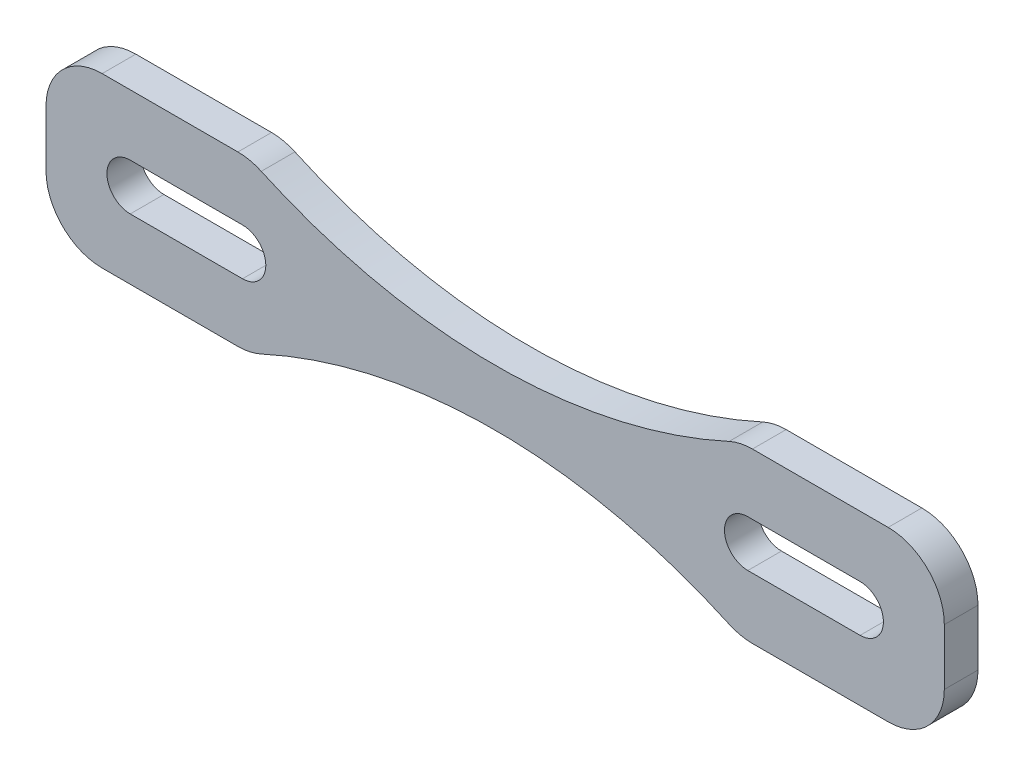
ISO-10303-21;
HEADER;
FILE_DESCRIPTION(('STEP AP214'),'2;1');
FILE_NAME('part.step','',(''),(''),'','','');
FILE_SCHEMA(('AUTOMOTIVE_DESIGN { 1 0 10303 214 1 1 1 1 }'));
ENDSEC;
DATA;
#1=APPLICATION_CONTEXT('core data for automotive mechanical design processes');
#2=APPLICATION_PROTOCOL_DEFINITION('international standard','automotive_design',2000,#1);
#3=PRODUCT_CONTEXT('',#1,'mechanical');
#4=PRODUCT('Part','Part','',(#3));
#5=PRODUCT_RELATED_PRODUCT_CATEGORY('part','',(#4));
#6=PRODUCT_DEFINITION_FORMATION('','',#4);
#7=PRODUCT_DEFINITION_CONTEXT('part definition',#1,'design');
#8=PRODUCT_DEFINITION('design','',#6,#7);
#9=PRODUCT_DEFINITION_SHAPE('','',#8);
#10=(LENGTH_UNIT() NAMED_UNIT(*) SI_UNIT(.MILLI.,.METRE.));
#11=(NAMED_UNIT(*) PLANE_ANGLE_UNIT() SI_UNIT($,.RADIAN.));
#12=(NAMED_UNIT(*) SI_UNIT($,.STERADIAN.) SOLID_ANGLE_UNIT());
#13=UNCERTAINTY_MEASURE_WITH_UNIT(LENGTH_MEASURE(1.E-05),#10,'distance_accuracy_value','');
#14=(GEOMETRIC_REPRESENTATION_CONTEXT(3) GLOBAL_UNCERTAINTY_ASSIGNED_CONTEXT((#13)) GLOBAL_UNIT_ASSIGNED_CONTEXT((#10,
#11,#12)) REPRESENTATION_CONTEXT('',''));
#15=CARTESIAN_POINT('',(0.,0.,0.));
#16=DIRECTION('',(0.,0.,1.));
#17=DIRECTION('',(1.,0.,0.));
#18=AXIS2_PLACEMENT_3D('',#15,#16,#17);
#19=CARTESIAN_POINT('',(0.,-105.,6.));
#20=DIRECTION('',(0.,0.,-1.));
#21=DIRECTION('',(-1.,0.,0.));
#22=AXIS2_PLACEMENT_3D('',#19,#20,#21);
#23=PLANE('',#22);
#24=CARTESIAN_POINT('',(-65.,0.,6.));
#25=DIRECTION('',(0.,0.,1.));
#26=DIRECTION('',(1.,0.,0.));
#27=AXIS2_PLACEMENT_3D('',#24,#25,#26);
#28=CIRCLE('',#27,4.14999999999997);
#29=CARTESIAN_POINT('',(-65.,4.14999999999995,6.));
#30=VERTEX_POINT('',#29);
#31=CARTESIAN_POINT('',(-65.,-4.14999999999998,6.));
#32=VERTEX_POINT('',#31);
#33=EDGE_CURVE('E248',#30,#32,#28,.T.);
#34=ORIENTED_EDGE('',*,*,#33,.F.);
#35=DIRECTION('',(-1.,0.,0.));
#36=VECTOR('',#35,1.);
#37=CARTESIAN_POINT('',(-65.,4.14999999999995,6.));
#38=LINE('',#37,#36);
#39=CARTESIAN_POINT('',(-45.,4.14999999999995,6.));
#40=VERTEX_POINT('',#39);
#41=EDGE_CURVE('E256',#40,#30,#38,.T.);
#42=ORIENTED_EDGE('',*,*,#41,.F.);
#43=CARTESIAN_POINT('',(-45.,0.,6.));
#44=DIRECTION('',(0.,0.,1.));
#45=DIRECTION('',(1.,0.,0.));
#46=AXIS2_PLACEMENT_3D('',#43,#44,#45);
#47=CIRCLE('',#46,4.14999999999997);
#48=CARTESIAN_POINT('',(-45.,-4.14999999999996,6.));
#49=VERTEX_POINT('',#48);
#50=EDGE_CURVE('E253',#49,#40,#47,.T.);
#51=ORIENTED_EDGE('',*,*,#50,.F.);
#52=DIRECTION('',(1.,0.,0.));
#53=VECTOR('',#52,1.);
#54=CARTESIAN_POINT('',(-65.,-4.14999999999998,6.));
#55=LINE('',#54,#53);
#56=EDGE_CURVE('E250',#32,#49,#55,.T.);
#57=ORIENTED_EDGE('',*,*,#56,.F.);
#58=EDGE_LOOP('',(#34,#42,#51,#57));
#59=FACE_BOUND('',#58,.T.);
#60=DIRECTION('',(0.,1.,0.));
#61=VECTOR('',#60,1.);
#62=CARTESIAN_POINT('',(79.9999999999999,-15.,6.));
#63=LINE('',#62,#61);
#64=CARTESIAN_POINT('',(79.9999999999999,-5.,6.));
#65=VERTEX_POINT('',#64);
#66=CARTESIAN_POINT('',(79.9999999999999,5.00000000000001,6.));
#67=VERTEX_POINT('',#66);
#68=EDGE_CURVE('E299',#65,#67,#63,.T.);
#69=ORIENTED_EDGE('',*,*,#68,.T.);
#70=CARTESIAN_POINT('',(69.9999999999999,5.00000000000001,6.));
#71=DIRECTION('',(0.,0.,-1.));
#72=DIRECTION('',(-1.,0.,0.));
#73=AXIS2_PLACEMENT_3D('',#70,#71,#72);
#74=CIRCLE('',#73,10.);
#75=CARTESIAN_POINT('',(69.9999999999999,15.,6.));
#76=VERTEX_POINT('',#75);
#77=EDGE_CURVE('E362',#67,#76,#74,.F.);
#78=ORIENTED_EDGE('',*,*,#77,.T.);
#79=DIRECTION('',(-1.,0.,0.));
#80=VECTOR('',#79,1.);
#81=CARTESIAN_POINT('',(43.5889894354068,15.,6.));
#82=LINE('',#81,#80);
#83=CARTESIAN_POINT('',(45.8257569495584,15.,6.));
#84=VERTEX_POINT('',#83);
#85=EDGE_CURVE('E279',#76,#84,#82,.T.);
#86=ORIENTED_EDGE('',*,*,#85,.T.);
#87=CARTESIAN_POINT('',(45.8257569495584,5.00000000000002,6.));
#88=DIRECTION('',(0.,0.,-1.));
#89=DIRECTION('',(-1.,0.,0.));
#90=AXIS2_PLACEMENT_3D('',#87,#88,#89);
#91=CIRCLE('',#90,10.);
#92=CARTESIAN_POINT('',(41.6597790450531,14.0909090909091,6.));
#93=VERTEX_POINT('',#92);
#94=EDGE_CURVE('E351',#84,#93,#91,.F.);
#95=ORIENTED_EDGE('',*,*,#94,.T.);
#96=CARTESIAN_POINT('',(0.,105.,6.));
#97=DIRECTION('',(0.,0.,-1.));
#98=DIRECTION('',(1.,0.,0.));
#99=AXIS2_PLACEMENT_3D('',#96,#97,#98);
#100=CIRCLE('',#99,100.);
#101=CARTESIAN_POINT('',(-41.6597790450531,14.0909090909091,6.));
#102=VERTEX_POINT('',#101);
#103=EDGE_CURVE('E282',#93,#102,#100,.T.);
#104=ORIENTED_EDGE('',*,*,#103,.T.);
#105=CARTESIAN_POINT('',(-45.8257569495584,5.00000000000003,6.));
#106=DIRECTION('',(0.,0.,-1.));
#107=DIRECTION('',(-1.,0.,0.));
#108=AXIS2_PLACEMENT_3D('',#105,#106,#107);
#109=CIRCLE('',#108,10.);
#110=CARTESIAN_POINT('',(-45.8257569495584,15.,6.));
#111=VERTEX_POINT('',#110);
#112=EDGE_CURVE('E349',#102,#111,#109,.F.);
#113=ORIENTED_EDGE('',*,*,#112,.T.);
#114=DIRECTION('',(-1.,0.,0.));
#115=VECTOR('',#114,1.);
#116=CARTESIAN_POINT('',(-80.0000000000001,15.,6.));
#117=LINE('',#116,#115);
#118=CARTESIAN_POINT('',(-70.0000000000001,15.,6.));
#119=VERTEX_POINT('',#118);
#120=EDGE_CURVE('E286',#111,#119,#117,.T.);
#121=ORIENTED_EDGE('',*,*,#120,.T.);
#122=CARTESIAN_POINT('',(-70.0000000000001,5.00000000000004,6.));
#123=DIRECTION('',(0.,0.,-1.));
#124=DIRECTION('',(-1.,0.,0.));
#125=AXIS2_PLACEMENT_3D('',#122,#123,#124);
#126=CIRCLE('',#125,10.);
#127=CARTESIAN_POINT('',(-80.0000000000001,5.00000000000004,6.));
#128=VERTEX_POINT('',#127);
#129=EDGE_CURVE('E353',#119,#128,#126,.F.);
#130=ORIENTED_EDGE('',*,*,#129,.T.);
#131=DIRECTION('',(0.,-1.,0.));
#132=VECTOR('',#131,1.);
#133=CARTESIAN_POINT('',(-80.0000000000001,-15.,6.));
#134=LINE('',#133,#132);
#135=CARTESIAN_POINT('',(-80.0000000000001,-5.00000000000004,6.));
#136=VERTEX_POINT('',#135);
#137=EDGE_CURVE('E289',#128,#136,#134,.T.);
#138=ORIENTED_EDGE('',*,*,#137,.T.);
#139=CARTESIAN_POINT('',(-70.0000000000001,-5.00000000000004,6.));
#140=DIRECTION('',(0.,0.,-1.));
#141=DIRECTION('',(-1.,0.,0.));
#142=AXIS2_PLACEMENT_3D('',#139,#140,#141);
#143=CIRCLE('',#142,10.);
#144=CARTESIAN_POINT('',(-70.0000000000001,-15.,6.));
#145=VERTEX_POINT('',#144);
#146=EDGE_CURVE('E355',#136,#145,#143,.F.);
#147=ORIENTED_EDGE('',*,*,#146,.T.);
#148=DIRECTION('',(1.,0.,0.));
#149=VECTOR('',#148,1.);
#150=CARTESIAN_POINT('',(-80.0000000000001,-15.,6.));
#151=LINE('',#150,#149);
#152=CARTESIAN_POINT('',(-45.8257569495584,-15.,6.));
#153=VERTEX_POINT('',#152);
#154=EDGE_CURVE('E292',#145,#153,#151,.T.);
#155=ORIENTED_EDGE('',*,*,#154,.T.);
#156=CARTESIAN_POINT('',(-45.8257569495584,-5.00000000000003,6.));
#157=DIRECTION('',(0.,0.,-1.));
#158=DIRECTION('',(-1.,0.,0.));
#159=AXIS2_PLACEMENT_3D('',#156,#157,#158);
#160=CIRCLE('',#159,10.);
#161=CARTESIAN_POINT('',(-41.6597790450531,-14.0909090909091,6.));
#162=VERTEX_POINT('',#161);
#163=EDGE_CURVE('E357',#153,#162,#160,.F.);
#164=ORIENTED_EDGE('',*,*,#163,.T.);
#165=CARTESIAN_POINT('',(0.,-105.,6.));
#166=DIRECTION('',(0.,0.,-1.));
#167=DIRECTION('',(-1.,0.,0.));
#168=AXIS2_PLACEMENT_3D('',#165,#166,#167);
#169=CIRCLE('',#168,100.);
#170=CARTESIAN_POINT('',(41.6597790450531,-14.0909090909091,6.));
#171=VERTEX_POINT('',#170);
#172=EDGE_CURVE('E295',#162,#171,#169,.T.);
#173=ORIENTED_EDGE('',*,*,#172,.T.);
#174=CARTESIAN_POINT('',(45.8257569495584,-5.00000000000001,6.));
#175=DIRECTION('',(0.,0.,-1.));
#176=DIRECTION('',(-1.,0.,0.));
#177=AXIS2_PLACEMENT_3D('',#174,#175,#176);
#178=CIRCLE('',#177,10.);
#179=CARTESIAN_POINT('',(45.8257569495584,-15.,6.));
#180=VERTEX_POINT('',#179);
#181=EDGE_CURVE('E65',#171,#180,#178,.F.);
#182=ORIENTED_EDGE('',*,*,#181,.T.);
#183=DIRECTION('',(1.,0.,0.));
#184=VECTOR('',#183,1.);
#185=CARTESIAN_POINT('',(43.5889894354068,-15.,6.));
#186=LINE('',#185,#184);
#187=CARTESIAN_POINT('',(69.9999999999999,-15.,6.));
#188=VERTEX_POINT('',#187);
#189=EDGE_CURVE('E297',#180,#188,#186,.T.);
#190=ORIENTED_EDGE('',*,*,#189,.T.);
#191=CARTESIAN_POINT('',(69.9999999999999,-5.,6.));
#192=DIRECTION('',(0.,0.,-1.));
#193=DIRECTION('',(-1.,0.,0.));
#194=AXIS2_PLACEMENT_3D('',#191,#192,#193);
#195=CIRCLE('',#194,10.);
#196=EDGE_CURVE('E360',#188,#65,#195,.F.);
#197=ORIENTED_EDGE('',*,*,#196,.T.);
#198=EDGE_LOOP('',(#69,#78,#86,#95,#104,#113,#121,#130,#138,#147,#155,#164,#173,#182,#190,#197));
#199=FACE_BOUND('',#198,.T.);
#200=CARTESIAN_POINT('',(65.,0.,6.));
#201=DIRECTION('',(0.,0.,1.));
#202=DIRECTION('',(-1.,0.,0.));
#203=AXIS2_PLACEMENT_3D('',#200,#201,#202);
#204=CIRCLE('',#203,4.14999999999997);
#205=CARTESIAN_POINT('',(65.,-4.14999999999997,6.));
#206=VERTEX_POINT('',#205);
#207=CARTESIAN_POINT('',(65.,4.14999999999997,6.));
#208=VERTEX_POINT('',#207);
#209=EDGE_CURVE('E207',#206,#208,#204,.T.);
#210=ORIENTED_EDGE('',*,*,#209,.F.);
#211=DIRECTION('',(1.,0.,0.));
#212=VECTOR('',#211,1.);
#213=CARTESIAN_POINT('',(65.,-4.14999999999997,6.));
#214=LINE('',#213,#212);
#215=CARTESIAN_POINT('',(45.,-4.14999999999997,6.));
#216=VERTEX_POINT('',#215);
#217=EDGE_CURVE('E232',#216,#206,#214,.T.);
#218=ORIENTED_EDGE('',*,*,#217,.F.);
#219=CARTESIAN_POINT('',(45.,0.,6.));
#220=DIRECTION('',(0.,0.,1.));
#221=DIRECTION('',(-1.,0.,0.));
#222=AXIS2_PLACEMENT_3D('',#219,#220,#221);
#223=CIRCLE('',#222,4.14999999999997);
#224=CARTESIAN_POINT('',(45.,4.14999999999997,6.));
#225=VERTEX_POINT('',#224);
#226=EDGE_CURVE('E230',#225,#216,#223,.T.);
#227=ORIENTED_EDGE('',*,*,#226,.F.);
#228=DIRECTION('',(-1.,0.,0.));
#229=VECTOR('',#228,1.);
#230=CARTESIAN_POINT('',(65.,4.14999999999997,6.));
#231=LINE('',#230,#229);
#232=EDGE_CURVE('E217',#208,#225,#231,.T.);
#233=ORIENTED_EDGE('',*,*,#232,.F.);
#234=EDGE_LOOP('',(#210,#218,#227,#233));
#235=FACE_BOUND('',#234,.T.);
#236=ADVANCED_FACE('F43',(#59,#199,#235),#23,.F.);
#237=CARTESIAN_POINT('',(0.,-105.,0.));
#238=DIRECTION('',(0.,0.,-1.));
#239=DIRECTION('',(-1.,0.,0.));
#240=AXIS2_PLACEMENT_3D('',#237,#238,#239);
#241=PLANE('',#240);
#242=DIRECTION('',(-1.,0.,0.));
#243=VECTOR('',#242,1.);
#244=CARTESIAN_POINT('',(43.5889894354068,15.,0.));
#245=LINE('',#244,#243);
#246=CARTESIAN_POINT('',(69.9999999999999,15.,0.));
#247=VERTEX_POINT('',#246);
#248=CARTESIAN_POINT('',(45.8257569495584,15.,0.));
#249=VERTEX_POINT('',#248);
#250=EDGE_CURVE('E278',#247,#249,#245,.T.);
#251=ORIENTED_EDGE('',*,*,#250,.F.);
#252=CARTESIAN_POINT('',(69.9999999999999,5.00000000000001,0.));
#253=DIRECTION('',(0.,0.,-1.));
#254=DIRECTION('',(-1.,0.,0.));
#255=AXIS2_PLACEMENT_3D('',#252,#253,#254);
#256=CIRCLE('',#255,10.);
#257=CARTESIAN_POINT('',(79.9999999999999,5.00000000000001,0.));
#258=VERTEX_POINT('',#257);
#259=EDGE_CURVE('E342',#247,#258,#256,.T.);
#260=ORIENTED_EDGE('',*,*,#259,.T.);
#261=DIRECTION('',(0.,1.,0.));
#262=VECTOR('',#261,1.);
#263=CARTESIAN_POINT('',(79.9999999999999,-15.,0.));
#264=LINE('',#263,#262);
#265=CARTESIAN_POINT('',(79.9999999999999,-5.,0.));
#266=VERTEX_POINT('',#265);
#267=EDGE_CURVE('E283',#266,#258,#264,.T.);
#268=ORIENTED_EDGE('',*,*,#267,.F.);
#269=CARTESIAN_POINT('',(69.9999999999999,-5.,0.));
#270=DIRECTION('',(0.,0.,-1.));
#271=DIRECTION('',(-1.,0.,0.));
#272=AXIS2_PLACEMENT_3D('',#269,#270,#271);
#273=CIRCLE('',#272,10.);
#274=CARTESIAN_POINT('',(69.9999999999999,-15.,0.));
#275=VERTEX_POINT('',#274);
#276=EDGE_CURVE('E340',#266,#275,#273,.T.);
#277=ORIENTED_EDGE('',*,*,#276,.T.);
#278=DIRECTION('',(1.,0.,0.));
#279=VECTOR('',#278,1.);
#280=CARTESIAN_POINT('',(43.5889894354068,-15.,0.));
#281=LINE('',#280,#279);
#282=CARTESIAN_POINT('',(45.8257569495584,-15.,0.));
#283=VERTEX_POINT('',#282);
#284=EDGE_CURVE('E320',#283,#275,#281,.T.);
#285=ORIENTED_EDGE('',*,*,#284,.F.);
#286=CARTESIAN_POINT('',(45.8257569495584,-5.00000000000001,0.));
#287=DIRECTION('',(0.,0.,-1.));
#288=DIRECTION('',(-1.,0.,0.));
#289=AXIS2_PLACEMENT_3D('',#286,#287,#288);
#290=CIRCLE('',#289,10.);
#291=CARTESIAN_POINT('',(41.6597790450531,-14.0909090909091,0.));
#292=VERTEX_POINT('',#291);
#293=EDGE_CURVE('E338',#283,#292,#290,.T.);
#294=ORIENTED_EDGE('',*,*,#293,.T.);
#295=CARTESIAN_POINT('',(0.,-105.,0.));
#296=DIRECTION('',(0.,0.,-1.));
#297=DIRECTION('',(-1.,0.,0.));
#298=AXIS2_PLACEMENT_3D('',#295,#296,#297);
#299=CIRCLE('',#298,100.);
#300=CARTESIAN_POINT('',(-41.6597790450531,-14.0909090909091,0.));
#301=VERTEX_POINT('',#300);
#302=EDGE_CURVE('E317',#301,#292,#299,.T.);
#303=ORIENTED_EDGE('',*,*,#302,.F.);
#304=CARTESIAN_POINT('',(-45.8257569495584,-5.00000000000003,0.));
#305=DIRECTION('',(0.,0.,-1.));
#306=DIRECTION('',(-1.,0.,0.));
#307=AXIS2_PLACEMENT_3D('',#304,#305,#306);
#308=CIRCLE('',#307,10.);
#309=CARTESIAN_POINT('',(-45.8257569495584,-15.,0.));
#310=VERTEX_POINT('',#309);
#311=EDGE_CURVE('E336',#301,#310,#308,.T.);
#312=ORIENTED_EDGE('',*,*,#311,.T.);
#313=DIRECTION('',(1.,0.,0.));
#314=VECTOR('',#313,1.);
#315=CARTESIAN_POINT('',(-80.0000000000001,-15.,0.));
#316=LINE('',#315,#314);
#317=CARTESIAN_POINT('',(-70.0000000000001,-15.,0.));
#318=VERTEX_POINT('',#317);
#319=EDGE_CURVE('E314',#318,#310,#316,.T.);
#320=ORIENTED_EDGE('',*,*,#319,.F.);
#321=CARTESIAN_POINT('',(-70.0000000000001,-5.00000000000004,0.));
#322=DIRECTION('',(0.,0.,-1.));
#323=DIRECTION('',(-1.,0.,0.));
#324=AXIS2_PLACEMENT_3D('',#321,#322,#323);
#325=CIRCLE('',#324,10.);
#326=CARTESIAN_POINT('',(-80.0000000000001,-5.00000000000004,0.));
#327=VERTEX_POINT('',#326);
#328=EDGE_CURVE('E334',#318,#327,#325,.T.);
#329=ORIENTED_EDGE('',*,*,#328,.T.);
#330=DIRECTION('',(0.,-1.,0.));
#331=VECTOR('',#330,1.);
#332=CARTESIAN_POINT('',(-80.0000000000001,-15.,0.));
#333=LINE('',#332,#331);
#334=CARTESIAN_POINT('',(-80.0000000000001,5.00000000000004,0.));
#335=VERTEX_POINT('',#334);
#336=EDGE_CURVE('E311',#335,#327,#333,.T.);
#337=ORIENTED_EDGE('',*,*,#336,.F.);
#338=CARTESIAN_POINT('',(-70.0000000000001,5.00000000000004,0.));
#339=DIRECTION('',(0.,0.,-1.));
#340=DIRECTION('',(-1.,0.,0.));
#341=AXIS2_PLACEMENT_3D('',#338,#339,#340);
#342=CIRCLE('',#341,10.);
#343=CARTESIAN_POINT('',(-70.0000000000001,15.,0.));
#344=VERTEX_POINT('',#343);
#345=EDGE_CURVE('E332',#335,#344,#342,.T.);
#346=ORIENTED_EDGE('',*,*,#345,.T.);
#347=DIRECTION('',(-1.,0.,0.));
#348=VECTOR('',#347,1.);
#349=CARTESIAN_POINT('',(-80.0000000000001,15.,0.));
#350=LINE('',#349,#348);
#351=CARTESIAN_POINT('',(-45.8257569495584,15.,0.));
#352=VERTEX_POINT('',#351);
#353=EDGE_CURVE('E308',#352,#344,#350,.T.);
#354=ORIENTED_EDGE('',*,*,#353,.F.);
#355=CARTESIAN_POINT('',(-45.8257569495584,5.00000000000003,0.));
#356=DIRECTION('',(0.,0.,-1.));
#357=DIRECTION('',(-1.,0.,0.));
#358=AXIS2_PLACEMENT_3D('',#355,#356,#357);
#359=CIRCLE('',#358,10.);
#360=CARTESIAN_POINT('',(-41.6597790450531,14.0909090909091,0.));
#361=VERTEX_POINT('',#360);
#362=EDGE_CURVE('E328',#352,#361,#359,.T.);
#363=ORIENTED_EDGE('',*,*,#362,.T.);
#364=CARTESIAN_POINT('',(0.,105.,0.));
#365=DIRECTION('',(0.,0.,-1.));
#366=DIRECTION('',(1.,0.,0.));
#367=AXIS2_PLACEMENT_3D('',#364,#365,#366);
#368=CIRCLE('',#367,100.);
#369=CARTESIAN_POINT('',(41.6597790450531,14.0909090909091,0.));
#370=VERTEX_POINT('',#369);
#371=EDGE_CURVE('E305',#370,#361,#368,.T.);
#372=ORIENTED_EDGE('',*,*,#371,.F.);
#373=CARTESIAN_POINT('',(45.8257569495584,5.00000000000002,0.));
#374=DIRECTION('',(0.,0.,-1.));
#375=DIRECTION('',(-1.,0.,0.));
#376=AXIS2_PLACEMENT_3D('',#373,#374,#375);
#377=CIRCLE('',#376,10.);
#378=EDGE_CURVE('E330',#370,#249,#377,.T.);
#379=ORIENTED_EDGE('',*,*,#378,.T.);
#380=EDGE_LOOP('',(#251,#260,#268,#277,#285,#294,#303,#312,#320,#329,#337,#346,#354,#363,#372,#379));
#381=FACE_BOUND('',#380,.T.);
#382=DIRECTION('',(-1.,0.,0.));
#383=VECTOR('',#382,1.);
#384=CARTESIAN_POINT('',(-65.,4.14999999999995,0.));
#385=LINE('',#384,#383);
#386=CARTESIAN_POINT('',(-45.,4.14999999999995,0.));
#387=VERTEX_POINT('',#386);
#388=CARTESIAN_POINT('',(-65.,4.14999999999995,0.));
#389=VERTEX_POINT('',#388);
#390=EDGE_CURVE('E251',#387,#389,#385,.T.);
#391=ORIENTED_EDGE('',*,*,#390,.T.);
#392=CARTESIAN_POINT('',(-65.,0.,0.));
#393=DIRECTION('',(0.,0.,1.));
#394=DIRECTION('',(1.,0.,0.));
#395=AXIS2_PLACEMENT_3D('',#392,#393,#394);
#396=CIRCLE('',#395,4.14999999999997);
#397=CARTESIAN_POINT('',(-65.,-4.14999999999998,0.));
#398=VERTEX_POINT('',#397);
#399=EDGE_CURVE('E225',#389,#398,#396,.T.);
#400=ORIENTED_EDGE('',*,*,#399,.T.);
#401=DIRECTION('',(1.,0.,0.));
#402=VECTOR('',#401,1.);
#403=CARTESIAN_POINT('',(-65.,-4.14999999999998,0.));
#404=LINE('',#403,#402);
#405=CARTESIAN_POINT('',(-45.,-4.14999999999996,0.));
#406=VERTEX_POINT('',#405);
#407=EDGE_CURVE('E261',#398,#406,#404,.T.);
#408=ORIENTED_EDGE('',*,*,#407,.T.);
#409=CARTESIAN_POINT('',(-45.,0.,0.));
#410=DIRECTION('',(0.,0.,1.));
#411=DIRECTION('',(1.,0.,0.));
#412=AXIS2_PLACEMENT_3D('',#409,#410,#411);
#413=CIRCLE('',#412,4.14999999999997);
#414=EDGE_CURVE('E264',#406,#387,#413,.T.);
#415=ORIENTED_EDGE('',*,*,#414,.T.);
#416=EDGE_LOOP('',(#391,#400,#408,#415));
#417=FACE_BOUND('',#416,.T.);
#418=DIRECTION('',(1.,0.,0.));
#419=VECTOR('',#418,1.);
#420=CARTESIAN_POINT('',(65.,-4.14999999999997,0.));
#421=LINE('',#420,#419);
#422=CARTESIAN_POINT('',(45.,-4.14999999999996,0.));
#423=VERTEX_POINT('',#422);
#424=CARTESIAN_POINT('',(65.,-4.14999999999997,0.));
#425=VERTEX_POINT('',#424);
#426=EDGE_CURVE('E218',#423,#425,#421,.T.);
#427=ORIENTED_EDGE('',*,*,#426,.T.);
#428=CARTESIAN_POINT('',(65.,0.,0.));
#429=DIRECTION('',(0.,0.,1.));
#430=DIRECTION('',(-1.,0.,0.));
#431=AXIS2_PLACEMENT_3D('',#428,#429,#430);
#432=CIRCLE('',#431,4.14999999999997);
#433=CARTESIAN_POINT('',(65.,4.14999999999997,0.));
#434=VERTEX_POINT('',#433);
#435=EDGE_CURVE('E236',#425,#434,#432,.T.);
#436=ORIENTED_EDGE('',*,*,#435,.T.);
#437=DIRECTION('',(-1.,0.,0.));
#438=VECTOR('',#437,1.);
#439=CARTESIAN_POINT('',(65.,4.14999999999997,0.));
#440=LINE('',#439,#438);
#441=CARTESIAN_POINT('',(45.,4.14999999999997,0.));
#442=VERTEX_POINT('',#441);
#443=EDGE_CURVE('E224',#434,#442,#440,.T.);
#444=ORIENTED_EDGE('',*,*,#443,.T.);
#445=CARTESIAN_POINT('',(45.,0.,0.));
#446=DIRECTION('',(0.,0.,1.));
#447=DIRECTION('',(-1.,0.,0.));
#448=AXIS2_PLACEMENT_3D('',#445,#446,#447);
#449=CIRCLE('',#448,4.14999999999997);
#450=EDGE_CURVE('E239',#442,#423,#449,.T.);
#451=ORIENTED_EDGE('',*,*,#450,.T.);
#452=EDGE_LOOP('',(#427,#436,#444,#451));
#453=FACE_BOUND('',#452,.T.);
#454=ADVANCED_FACE('F404',(#381,#417,#453),#241,.T.);
#455=CARTESIAN_POINT('',(43.5889894354068,15.,6.));
#456=DIRECTION('',(0.,-1.,0.));
#457=DIRECTION('',(1.,0.,0.));
#458=AXIS2_PLACEMENT_3D('',#455,#456,#457);
#459=PLANE('',#458);
#460=ORIENTED_EDGE('',*,*,#85,.F.);
#461=DIRECTION('',(0.,0.,-1.));
#462=VECTOR('',#461,1.);
#463=CARTESIAN_POINT('',(69.9999999999999,15.,6.));
#464=LINE('',#463,#462);
#465=EDGE_CURVE('E325',#76,#247,#464,.T.);
#466=ORIENTED_EDGE('',*,*,#465,.T.);
#467=ORIENTED_EDGE('',*,*,#250,.T.);
#468=DIRECTION('',(0.,0.,-1.));
#469=VECTOR('',#468,1.);
#470=CARTESIAN_POINT('',(45.8257569495584,15.,6.));
#471=LINE('',#470,#469);
#472=EDGE_CURVE('E302',#249,#84,#471,.F.);
#473=ORIENTED_EDGE('',*,*,#472,.T.);
#474=EDGE_LOOP('',(#460,#466,#467,#473));
#475=FACE_BOUND('',#474,.T.);
#476=ADVANCED_FACE('F453',(#475),#459,.F.);
#477=CARTESIAN_POINT('',(0.,105.,6.));
#478=DIRECTION('',(0.,0.,-1.));
#479=DIRECTION('',(-1.,0.,0.));
#480=AXIS2_PLACEMENT_3D('',#477,#478,#479);
#481=CYLINDRICAL_SURFACE('',#480,100.);
#482=ORIENTED_EDGE('',*,*,#103,.F.);
#483=DIRECTION('',(0.,0.,-1.));
#484=VECTOR('',#483,1.);
#485=CARTESIAN_POINT('',(41.6597790450531,14.0909090909091,6.));
#486=LINE('',#485,#484);
#487=EDGE_CURVE('E11',#93,#370,#486,.T.);
#488=ORIENTED_EDGE('',*,*,#487,.T.);
#489=ORIENTED_EDGE('',*,*,#371,.T.);
#490=DIRECTION('',(0.,0.,-1.));
#491=VECTOR('',#490,1.);
#492=CARTESIAN_POINT('',(-41.6597790450531,14.0909090909091,6.));
#493=LINE('',#492,#491);
#494=EDGE_CURVE('E51',#361,#102,#493,.F.);
#495=ORIENTED_EDGE('',*,*,#494,.T.);
#496=EDGE_LOOP('',(#482,#488,#489,#495));
#497=FACE_BOUND('',#496,.T.);
#498=ADVANCED_FACE('F390',(#497),#481,.F.);
#499=CARTESIAN_POINT('',(-80.0000000000001,15.,6.));
#500=DIRECTION('',(0.,-1.,0.));
#501=DIRECTION('',(1.,0.,0.));
#502=AXIS2_PLACEMENT_3D('',#499,#500,#501);
#503=PLANE('',#502);
#504=ORIENTED_EDGE('',*,*,#353,.T.);
#505=DIRECTION('',(0.,0.,-1.));
#506=VECTOR('',#505,1.);
#507=CARTESIAN_POINT('',(-70.0000000000001,15.,6.));
#508=LINE('',#507,#506);
#509=EDGE_CURVE('E386',#344,#119,#508,.F.);
#510=ORIENTED_EDGE('',*,*,#509,.T.);
#511=ORIENTED_EDGE('',*,*,#120,.F.);
#512=DIRECTION('',(0.,0.,-1.));
#513=VECTOR('',#512,1.);
#514=CARTESIAN_POINT('',(-45.8257569495584,15.,6.));
#515=LINE('',#514,#513);
#516=EDGE_CURVE('E383',#111,#352,#515,.T.);
#517=ORIENTED_EDGE('',*,*,#516,.T.);
#518=EDGE_LOOP('',(#504,#510,#511,#517));
#519=FACE_BOUND('',#518,.T.);
#520=ADVANCED_FACE('F400',(#519),#503,.F.);
#521=CARTESIAN_POINT('',(-80.0000000000001,-15.,6.));
#522=DIRECTION('',(1.,0.,0.));
#523=DIRECTION('',(0.,0.,-1.));
#524=AXIS2_PLACEMENT_3D('',#521,#522,#523);
#525=PLANE('',#524);
#526=ORIENTED_EDGE('',*,*,#336,.T.);
#527=DIRECTION('',(0.,0.,-1.));
#528=VECTOR('',#527,1.);
#529=CARTESIAN_POINT('',(-80.0000000000001,-5.00000000000004,6.));
#530=LINE('',#529,#528);
#531=EDGE_CURVE('E381',#327,#136,#530,.F.);
#532=ORIENTED_EDGE('',*,*,#531,.T.);
#533=ORIENTED_EDGE('',*,*,#137,.F.);
#534=DIRECTION('',(0.,0.,-1.));
#535=VECTOR('',#534,1.);
#536=CARTESIAN_POINT('',(-80.0000000000001,5.00000000000004,6.));
#537=LINE('',#536,#535);
#538=EDGE_CURVE('E378',#128,#335,#537,.T.);
#539=ORIENTED_EDGE('',*,*,#538,.T.);
#540=EDGE_LOOP('',(#526,#532,#533,#539));
#541=FACE_BOUND('',#540,.T.);
#542=ADVANCED_FACE('F413',(#541),#525,.F.);
#543=CARTESIAN_POINT('',(-80.0000000000001,-15.,6.));
#544=DIRECTION('',(0.,1.,0.));
#545=DIRECTION('',(-1.,0.,0.));
#546=AXIS2_PLACEMENT_3D('',#543,#544,#545);
#547=PLANE('',#546);
#548=ORIENTED_EDGE('',*,*,#319,.T.);
#549=DIRECTION('',(0.,0.,-1.));
#550=VECTOR('',#549,1.);
#551=CARTESIAN_POINT('',(-45.8257569495584,-15.,6.));
#552=LINE('',#551,#550);
#553=EDGE_CURVE('E376',#310,#153,#552,.F.);
#554=ORIENTED_EDGE('',*,*,#553,.T.);
#555=ORIENTED_EDGE('',*,*,#154,.F.);
#556=DIRECTION('',(0.,0.,-1.));
#557=VECTOR('',#556,1.);
#558=CARTESIAN_POINT('',(-70.0000000000001,-15.,6.));
#559=LINE('',#558,#557);
#560=EDGE_CURVE('E373',#145,#318,#559,.T.);
#561=ORIENTED_EDGE('',*,*,#560,.T.);
#562=EDGE_LOOP('',(#548,#554,#555,#561));
#563=FACE_BOUND('',#562,.T.);
#564=ADVANCED_FACE('F422',(#563),#547,.F.);
#565=CARTESIAN_POINT('',(0.,-105.,6.));
#566=DIRECTION('',(0.,0.,-1.));
#567=DIRECTION('',(-1.,0.,0.));
#568=AXIS2_PLACEMENT_3D('',#565,#566,#567);
#569=CYLINDRICAL_SURFACE('',#568,100.);
#570=ORIENTED_EDGE('',*,*,#302,.T.);
#571=DIRECTION('',(0.,0.,-1.));
#572=VECTOR('',#571,1.);
#573=CARTESIAN_POINT('',(41.6597790450531,-14.0909090909091,6.));
#574=LINE('',#573,#572);
#575=EDGE_CURVE('E371',#292,#171,#574,.F.);
#576=ORIENTED_EDGE('',*,*,#575,.T.);
#577=ORIENTED_EDGE('',*,*,#172,.F.);
#578=DIRECTION('',(0.,0.,-1.));
#579=VECTOR('',#578,1.);
#580=CARTESIAN_POINT('',(-41.6597790450531,-14.0909090909091,6.));
#581=LINE('',#580,#579);
#582=EDGE_CURVE('E368',#162,#301,#581,.T.);
#583=ORIENTED_EDGE('',*,*,#582,.T.);
#584=EDGE_LOOP('',(#570,#576,#577,#583));
#585=FACE_BOUND('',#584,.T.);
#586=ADVANCED_FACE('F431',(#585),#569,.F.);
#587=CARTESIAN_POINT('',(43.5889894354068,-15.,6.));
#588=DIRECTION('',(0.,1.,0.));
#589=DIRECTION('',(-1.,0.,0.));
#590=AXIS2_PLACEMENT_3D('',#587,#588,#589);
#591=PLANE('',#590);
#592=ORIENTED_EDGE('',*,*,#284,.T.);
#593=DIRECTION('',(0.,0.,-1.));
#594=VECTOR('',#593,1.);
#595=CARTESIAN_POINT('',(69.9999999999999,-15.,6.));
#596=LINE('',#595,#594);
#597=EDGE_CURVE('E58',#275,#188,#596,.F.);
#598=ORIENTED_EDGE('',*,*,#597,.T.);
#599=ORIENTED_EDGE('',*,*,#189,.F.);
#600=DIRECTION('',(0.,0.,-1.));
#601=VECTOR('',#600,1.);
#602=CARTESIAN_POINT('',(45.8257569495584,-15.,6.));
#603=LINE('',#602,#601);
#604=EDGE_CURVE('E364',#180,#283,#603,.T.);
#605=ORIENTED_EDGE('',*,*,#604,.T.);
#606=EDGE_LOOP('',(#592,#598,#599,#605));
#607=FACE_BOUND('',#606,.T.);
#608=ADVANCED_FACE('F437',(#607),#591,.F.);
#609=CARTESIAN_POINT('',(79.9999999999999,-15.,6.));
#610=DIRECTION('',(-1.,0.,0.));
#611=DIRECTION('',(0.,0.,1.));
#612=AXIS2_PLACEMENT_3D('',#609,#610,#611);
#613=PLANE('',#612);
#614=ORIENTED_EDGE('',*,*,#267,.T.);
#615=DIRECTION('',(0.,0.,-1.));
#616=VECTOR('',#615,1.);
#617=CARTESIAN_POINT('',(79.9999999999999,5.00000000000001,6.));
#618=LINE('',#617,#616);
#619=EDGE_CURVE('E347',#258,#67,#618,.F.);
#620=ORIENTED_EDGE('',*,*,#619,.T.);
#621=ORIENTED_EDGE('',*,*,#68,.F.);
#622=DIRECTION('',(0.,0.,-1.));
#623=VECTOR('',#622,1.);
#624=CARTESIAN_POINT('',(79.9999999999999,-5.,6.));
#625=LINE('',#624,#623);
#626=EDGE_CURVE('E344',#65,#266,#625,.T.);
#627=ORIENTED_EDGE('',*,*,#626,.T.);
#628=EDGE_LOOP('',(#614,#620,#621,#627));
#629=FACE_BOUND('',#628,.T.);
#630=ADVANCED_FACE('F445',(#629),#613,.F.);
#631=CARTESIAN_POINT('',(-65.,0.,6.));
#632=DIRECTION('',(0.,0.,-1.));
#633=DIRECTION('',(-1.,0.,0.));
#634=AXIS2_PLACEMENT_3D('',#631,#632,#633);
#635=CYLINDRICAL_SURFACE('',#634,4.14999999999997);
#636=ORIENTED_EDGE('',*,*,#399,.F.);
#637=DIRECTION('',(0.,0.,-1.));
#638=VECTOR('',#637,1.);
#639=CARTESIAN_POINT('',(-65.,4.14999999999995,6.));
#640=LINE('',#639,#638);
#641=EDGE_CURVE('E258',#30,#389,#640,.T.);
#642=ORIENTED_EDGE('',*,*,#641,.F.);
#643=ORIENTED_EDGE('',*,*,#33,.T.);
#644=DIRECTION('',(0.,0.,-1.));
#645=VECTOR('',#644,1.);
#646=CARTESIAN_POINT('',(-65.,-4.14999999999998,6.));
#647=LINE('',#646,#645);
#648=EDGE_CURVE('E275',#32,#398,#647,.T.);
#649=ORIENTED_EDGE('',*,*,#648,.T.);
#650=EDGE_LOOP('',(#636,#642,#643,#649));
#651=FACE_BOUND('',#650,.T.);
#652=ADVANCED_FACE('F472',(#651),#635,.F.);
#653=CARTESIAN_POINT('',(-65.,-4.14999999999998,6.));
#654=DIRECTION('',(0.,1.,0.));
#655=DIRECTION('',(-1.,0.,0.));
#656=AXIS2_PLACEMENT_3D('',#653,#654,#655);
#657=PLANE('',#656);
#658=ORIENTED_EDGE('',*,*,#407,.F.);
#659=ORIENTED_EDGE('',*,*,#648,.F.);
#660=ORIENTED_EDGE('',*,*,#56,.T.);
#661=DIRECTION('',(0.,0.,-1.));
#662=VECTOR('',#661,1.);
#663=CARTESIAN_POINT('',(-45.,-4.14999999999996,6.));
#664=LINE('',#663,#662);
#665=EDGE_CURVE('E273',#49,#406,#664,.T.);
#666=ORIENTED_EDGE('',*,*,#665,.T.);
#667=EDGE_LOOP('',(#658,#659,#660,#666));
#668=FACE_BOUND('',#667,.T.);
#669=ADVANCED_FACE('F616',(#668),#657,.T.);
#670=CARTESIAN_POINT('',(-45.,0.,6.));
#671=DIRECTION('',(0.,0.,-1.));
#672=DIRECTION('',(-1.,0.,0.));
#673=AXIS2_PLACEMENT_3D('',#670,#671,#672);
#674=CYLINDRICAL_SURFACE('',#673,4.14999999999997);
#675=ORIENTED_EDGE('',*,*,#414,.F.);
#676=ORIENTED_EDGE('',*,*,#665,.F.);
#677=ORIENTED_EDGE('',*,*,#50,.T.);
#678=DIRECTION('',(0.,0.,-1.));
#679=VECTOR('',#678,1.);
#680=CARTESIAN_POINT('',(-45.,4.14999999999995,6.));
#681=LINE('',#680,#679);
#682=EDGE_CURVE('E271',#40,#387,#681,.T.);
#683=ORIENTED_EDGE('',*,*,#682,.T.);
#684=EDGE_LOOP('',(#675,#676,#677,#683));
#685=FACE_BOUND('',#684,.T.);
#686=ADVANCED_FACE('F608',(#685),#674,.F.);
#687=CARTESIAN_POINT('',(-65.,4.14999999999995,6.));
#688=DIRECTION('',(0.,-1.,0.));
#689=DIRECTION('',(1.,0.,0.));
#690=AXIS2_PLACEMENT_3D('',#687,#688,#689);
#691=PLANE('',#690);
#692=ORIENTED_EDGE('',*,*,#390,.F.);
#693=ORIENTED_EDGE('',*,*,#682,.F.);
#694=ORIENTED_EDGE('',*,*,#41,.T.);
#695=ORIENTED_EDGE('',*,*,#641,.T.);
#696=EDGE_LOOP('',(#692,#693,#694,#695));
#697=FACE_BOUND('',#696,.T.);
#698=ADVANCED_FACE('F601',(#697),#691,.T.);
#699=CARTESIAN_POINT('',(65.,0.,6.));
#700=DIRECTION('',(0.,0.,-1.));
#701=DIRECTION('',(-1.,0.,0.));
#702=AXIS2_PLACEMENT_3D('',#699,#700,#701);
#703=CYLINDRICAL_SURFACE('',#702,4.14999999999997);
#704=ORIENTED_EDGE('',*,*,#435,.F.);
#705=DIRECTION('',(0.,0.,-1.));
#706=VECTOR('',#705,1.);
#707=CARTESIAN_POINT('',(65.,-4.14999999999997,6.));
#708=LINE('',#707,#706);
#709=EDGE_CURVE('E213',#206,#425,#708,.T.);
#710=ORIENTED_EDGE('',*,*,#709,.F.);
#711=ORIENTED_EDGE('',*,*,#209,.T.);
#712=DIRECTION('',(0.,0.,-1.));
#713=VECTOR('',#712,1.);
#714=CARTESIAN_POINT('',(65.,4.14999999999997,6.));
#715=LINE('',#714,#713);
#716=EDGE_CURVE('E210',#208,#434,#715,.T.);
#717=ORIENTED_EDGE('',*,*,#716,.T.);
#718=EDGE_LOOP('',(#704,#710,#711,#717));
#719=FACE_BOUND('',#718,.T.);
#720=ADVANCED_FACE('F209',(#719),#703,.F.);
#721=CARTESIAN_POINT('',(65.,4.14999999999997,6.));
#722=DIRECTION('',(0.,-1.,0.));
#723=DIRECTION('',(0.,0.,-1.));
#724=AXIS2_PLACEMENT_3D('',#721,#722,#723);
#725=PLANE('',#724);
#726=ORIENTED_EDGE('',*,*,#443,.F.);
#727=ORIENTED_EDGE('',*,*,#716,.F.);
#728=ORIENTED_EDGE('',*,*,#232,.T.);
#729=DIRECTION('',(0.,0.,-1.));
#730=VECTOR('',#729,1.);
#731=CARTESIAN_POINT('',(45.,4.14999999999997,6.));
#732=LINE('',#731,#730);
#733=EDGE_CURVE('E226',#225,#442,#732,.T.);
#734=ORIENTED_EDGE('',*,*,#733,.T.);
#735=EDGE_LOOP('',(#726,#727,#728,#734));
#736=FACE_BOUND('',#735,.T.);
#737=ADVANCED_FACE('F221',(#736),#725,.T.);
#738=CARTESIAN_POINT('',(45.,0.,6.));
#739=DIRECTION('',(0.,0.,-1.));
#740=DIRECTION('',(-1.,0.,0.));
#741=AXIS2_PLACEMENT_3D('',#738,#739,#740);
#742=CYLINDRICAL_SURFACE('',#741,4.14999999999997);
#743=ORIENTED_EDGE('',*,*,#450,.F.);
#744=ORIENTED_EDGE('',*,*,#733,.F.);
#745=ORIENTED_EDGE('',*,*,#226,.T.);
#746=DIRECTION('',(0.,0.,-1.));
#747=VECTOR('',#746,1.);
#748=CARTESIAN_POINT('',(45.,-4.14999999999996,6.));
#749=LINE('',#748,#747);
#750=EDGE_CURVE('E245',#216,#423,#749,.T.);
#751=ORIENTED_EDGE('',*,*,#750,.T.);
#752=EDGE_LOOP('',(#743,#744,#745,#751));
#753=FACE_BOUND('',#752,.T.);
#754=ADVANCED_FACE('F580',(#753),#742,.F.);
#755=CARTESIAN_POINT('',(65.,-4.14999999999997,6.));
#756=DIRECTION('',(0.,1.,0.));
#757=DIRECTION('',(0.,0.,1.));
#758=AXIS2_PLACEMENT_3D('',#755,#756,#757);
#759=PLANE('',#758);
#760=ORIENTED_EDGE('',*,*,#426,.F.);
#761=ORIENTED_EDGE('',*,*,#750,.F.);
#762=ORIENTED_EDGE('',*,*,#217,.T.);
#763=ORIENTED_EDGE('',*,*,#709,.T.);
#764=EDGE_LOOP('',(#760,#761,#762,#763));
#765=FACE_BOUND('',#764,.T.);
#766=ADVANCED_FACE('F493',(#765),#759,.T.);
#767=CARTESIAN_POINT('',(69.9999999999999,5.00000000000001,6.));
#768=DIRECTION('',(0.,0.,-1.));
#769=DIRECTION('',(-1.,0.,0.));
#770=AXIS2_PLACEMENT_3D('',#767,#768,#769);
#771=CYLINDRICAL_SURFACE('',#770,10.);
#772=ORIENTED_EDGE('',*,*,#77,.F.);
#773=ORIENTED_EDGE('',*,*,#619,.F.);
#774=ORIENTED_EDGE('',*,*,#259,.F.);
#775=ORIENTED_EDGE('',*,*,#465,.F.);
#776=EDGE_LOOP('',(#772,#773,#774,#775));
#777=FACE_BOUND('',#776,.T.);
#778=ADVANCED_FACE('F451',(#777),#771,.T.);
#779=CARTESIAN_POINT('',(69.9999999999999,-5.,6.));
#780=DIRECTION('',(0.,0.,-1.));
#781=DIRECTION('',(-1.,0.,0.));
#782=AXIS2_PLACEMENT_3D('',#779,#780,#781);
#783=CYLINDRICAL_SURFACE('',#782,10.);
#784=ORIENTED_EDGE('',*,*,#196,.F.);
#785=ORIENTED_EDGE('',*,*,#597,.F.);
#786=ORIENTED_EDGE('',*,*,#276,.F.);
#787=ORIENTED_EDGE('',*,*,#626,.F.);
#788=EDGE_LOOP('',(#784,#785,#786,#787));
#789=FACE_BOUND('',#788,.T.);
#790=ADVANCED_FACE('F442',(#789),#783,.T.);
#791=CARTESIAN_POINT('',(45.8257569495584,-5.00000000000001,6.));
#792=DIRECTION('',(0.,0.,-1.));
#793=DIRECTION('',(-1.,0.,0.));
#794=AXIS2_PLACEMENT_3D('',#791,#792,#793);
#795=CYLINDRICAL_SURFACE('',#794,10.);
#796=ORIENTED_EDGE('',*,*,#181,.F.);
#797=ORIENTED_EDGE('',*,*,#575,.F.);
#798=ORIENTED_EDGE('',*,*,#293,.F.);
#799=ORIENTED_EDGE('',*,*,#604,.F.);
#800=EDGE_LOOP('',(#796,#797,#798,#799));
#801=FACE_BOUND('',#800,.T.);
#802=ADVANCED_FACE('F435',(#801),#795,.T.);
#803=CARTESIAN_POINT('',(-45.8257569495584,-5.00000000000003,6.));
#804=DIRECTION('',(0.,0.,-1.));
#805=DIRECTION('',(-1.,0.,0.));
#806=AXIS2_PLACEMENT_3D('',#803,#804,#805);
#807=CYLINDRICAL_SURFACE('',#806,10.);
#808=ORIENTED_EDGE('',*,*,#163,.F.);
#809=ORIENTED_EDGE('',*,*,#553,.F.);
#810=ORIENTED_EDGE('',*,*,#311,.F.);
#811=ORIENTED_EDGE('',*,*,#582,.F.);
#812=EDGE_LOOP('',(#808,#809,#810,#811));
#813=FACE_BOUND('',#812,.T.);
#814=ADVANCED_FACE('F428',(#813),#807,.T.);
#815=CARTESIAN_POINT('',(-70.0000000000001,-5.00000000000004,6.));
#816=DIRECTION('',(0.,0.,-1.));
#817=DIRECTION('',(-1.,0.,0.));
#818=AXIS2_PLACEMENT_3D('',#815,#816,#817);
#819=CYLINDRICAL_SURFACE('',#818,10.);
#820=ORIENTED_EDGE('',*,*,#146,.F.);
#821=ORIENTED_EDGE('',*,*,#531,.F.);
#822=ORIENTED_EDGE('',*,*,#328,.F.);
#823=ORIENTED_EDGE('',*,*,#560,.F.);
#824=EDGE_LOOP('',(#820,#821,#822,#823));
#825=FACE_BOUND('',#824,.T.);
#826=ADVANCED_FACE('F419',(#825),#819,.T.);
#827=CARTESIAN_POINT('',(-70.0000000000001,5.00000000000004,6.));
#828=DIRECTION('',(0.,0.,-1.));
#829=DIRECTION('',(-1.,0.,0.));
#830=AXIS2_PLACEMENT_3D('',#827,#828,#829);
#831=CYLINDRICAL_SURFACE('',#830,10.);
#832=ORIENTED_EDGE('',*,*,#129,.F.);
#833=ORIENTED_EDGE('',*,*,#509,.F.);
#834=ORIENTED_EDGE('',*,*,#345,.F.);
#835=ORIENTED_EDGE('',*,*,#538,.F.);
#836=EDGE_LOOP('',(#832,#833,#834,#835));
#837=FACE_BOUND('',#836,.T.);
#838=ADVANCED_FACE('F410',(#837),#831,.T.);
#839=CARTESIAN_POINT('',(45.8257569495584,5.00000000000002,6.));
#840=DIRECTION('',(0.,0.,-1.));
#841=DIRECTION('',(-1.,0.,0.));
#842=AXIS2_PLACEMENT_3D('',#839,#840,#841);
#843=CYLINDRICAL_SURFACE('',#842,10.);
#844=ORIENTED_EDGE('',*,*,#94,.F.);
#845=ORIENTED_EDGE('',*,*,#472,.F.);
#846=ORIENTED_EDGE('',*,*,#378,.F.);
#847=ORIENTED_EDGE('',*,*,#487,.F.);
#848=EDGE_LOOP('',(#844,#845,#846,#847));
#849=FACE_BOUND('',#848,.T.);
#850=ADVANCED_FACE('F456',(#849),#843,.T.);
#851=CARTESIAN_POINT('',(-45.8257569495584,5.00000000000003,6.));
#852=DIRECTION('',(0.,0.,-1.));
#853=DIRECTION('',(-1.,0.,0.));
#854=AXIS2_PLACEMENT_3D('',#851,#852,#853);
#855=CYLINDRICAL_SURFACE('',#854,10.);
#856=ORIENTED_EDGE('',*,*,#112,.F.);
#857=ORIENTED_EDGE('',*,*,#494,.F.);
#858=ORIENTED_EDGE('',*,*,#362,.F.);
#859=ORIENTED_EDGE('',*,*,#516,.F.);
#860=EDGE_LOOP('',(#856,#857,#858,#859));
#861=FACE_BOUND('',#860,.T.);
#862=ADVANCED_FACE('F45',(#861),#855,.T.);
#863=CLOSED_SHELL('',(#236,#454,#476,#498,#520,#542,#564,#586,#608,#630,#652,#669,#686,#698,
#720,#737,#754,#766,#778,#790,#802,#814,#826,#838,#850,#862));
#864=MANIFOLD_SOLID_BREP('B2',#863);
#865=ADVANCED_BREP_SHAPE_REPRESENTATION('',(#18,#864),#14);
#866=SHAPE_DEFINITION_REPRESENTATION(#9,#865);
ENDSEC;
END-ISO-10303-21;
